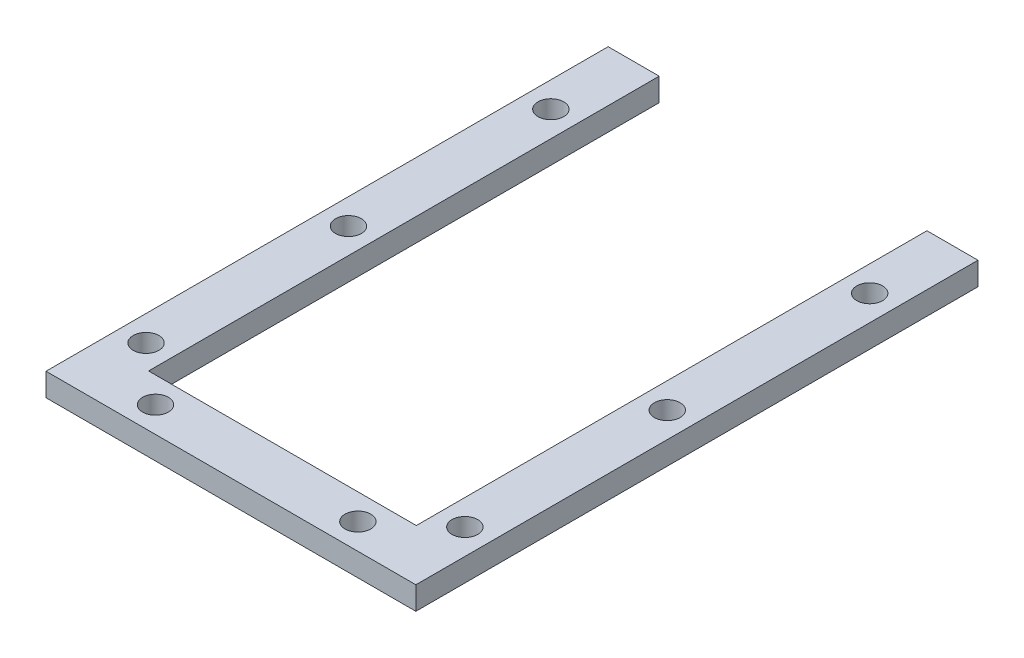
ISO-10303-21;
HEADER;
FILE_DESCRIPTION(('STEP AP214'),'2;1');
FILE_NAME('part.step','',(''),(''),'','','');
FILE_SCHEMA(('AUTOMOTIVE_DESIGN { 1 0 10303 214 1 1 1 1 }'));
ENDSEC;
DATA;
#1=APPLICATION_CONTEXT('core data for automotive mechanical design processes');
#2=APPLICATION_PROTOCOL_DEFINITION('international standard','automotive_design',2000,#1);
#3=PRODUCT_CONTEXT('',#1,'mechanical');
#4=PRODUCT('Part','Part','',(#3));
#5=PRODUCT_RELATED_PRODUCT_CATEGORY('part','',(#4));
#6=PRODUCT_DEFINITION_FORMATION('','',#4);
#7=PRODUCT_DEFINITION_CONTEXT('part definition',#1,'design');
#8=PRODUCT_DEFINITION('design','',#6,#7);
#9=PRODUCT_DEFINITION_SHAPE('','',#8);
#10=(LENGTH_UNIT() NAMED_UNIT(*) SI_UNIT(.MILLI.,.METRE.));
#11=(NAMED_UNIT(*) PLANE_ANGLE_UNIT() SI_UNIT($,.RADIAN.));
#12=(NAMED_UNIT(*) SI_UNIT($,.STERADIAN.) SOLID_ANGLE_UNIT());
#13=UNCERTAINTY_MEASURE_WITH_UNIT(LENGTH_MEASURE(1.E-05),#10,'distance_accuracy_value','');
#14=(GEOMETRIC_REPRESENTATION_CONTEXT(3) GLOBAL_UNCERTAINTY_ASSIGNED_CONTEXT((#13)) GLOBAL_UNIT_ASSIGNED_CONTEXT((#10,
#11,#12)) REPRESENTATION_CONTEXT('',''));
#15=CARTESIAN_POINT('',(0.,0.,0.));
#16=DIRECTION('',(0.,0.,1.));
#17=DIRECTION('',(1.,0.,0.));
#18=AXIS2_PLACEMENT_3D('',#15,#16,#17);
#19=CARTESIAN_POINT('',(0.,2.5,0.));
#20=DIRECTION('',(0.,1.,0.));
#21=DIRECTION('',(0.,0.,1.));
#22=AXIS2_PLACEMENT_3D('',#19,#20,#21);
#23=PLANE('',#22);
#24=CARTESIAN_POINT('',(17.3249999999997,2.5,-24.5));
#25=DIRECTION('',(0.,1.,0.));
#26=DIRECTION('',(0.,0.,-1.));
#27=AXIS2_PLACEMENT_3D('',#24,#25,#26);
#28=CIRCLE('',#27,1.39999999999999);
#29=CARTESIAN_POINT('',(17.3249999999997,2.5,-25.9));
#30=VERTEX_POINT('',#29);
#31=EDGE_CURVE('E211',#30,#30,#28,.T.);
#32=ORIENTED_EDGE('',*,*,#31,.F.);
#33=EDGE_LOOP('',(#32));
#34=FACE_BOUND('',#33,.T.);
#35=CARTESIAN_POINT('',(-17.3249999999996,2.5,-2.5));
#36=DIRECTION('',(0.,1.,0.));
#37=DIRECTION('',(0.,0.,1.));
#38=AXIS2_PLACEMENT_3D('',#35,#36,#37);
#39=CIRCLE('',#38,1.4);
#40=CARTESIAN_POINT('',(-17.3249999999996,2.5,-1.1));
#41=VERTEX_POINT('',#40);
#42=EDGE_CURVE('E199',#41,#41,#39,.T.);
#43=ORIENTED_EDGE('',*,*,#42,.F.);
#44=EDGE_LOOP('',(#43));
#45=FACE_BOUND('',#44,.T.);
#46=CARTESIAN_POINT('',(-17.325,2.5,-46.5));
#47=DIRECTION('',(0.,1.,0.));
#48=DIRECTION('',(0.,0.,1.));
#49=AXIS2_PLACEMENT_3D('',#46,#47,#48);
#50=CIRCLE('',#49,1.4);
#51=CARTESIAN_POINT('',(-17.325,2.5,-45.1));
#52=VERTEX_POINT('',#51);
#53=EDGE_CURVE('E187',#52,#52,#50,.T.);
#54=ORIENTED_EDGE('',*,*,#53,.F.);
#55=EDGE_LOOP('',(#54));
#56=FACE_BOUND('',#55,.T.);
#57=CARTESIAN_POINT('',(-11.,2.5,2.79999999999999));
#58=DIRECTION('',(0.,1.,0.));
#59=DIRECTION('',(0.,0.,1.));
#60=AXIS2_PLACEMENT_3D('',#57,#58,#59);
#61=CIRCLE('',#60,1.4);
#62=CARTESIAN_POINT('',(-11.,2.5,4.19999999999999));
#63=VERTEX_POINT('',#62);
#64=EDGE_CURVE('E133',#63,#63,#61,.T.);
#65=ORIENTED_EDGE('',*,*,#64,.F.);
#66=EDGE_LOOP('',(#65));
#67=FACE_BOUND('',#66,.T.);
#68=DIRECTION('',(-1.,0.,0.));
#69=VECTOR('',#68,1.);
#70=CARTESIAN_POINT('',(-14.55,2.5,-55.5));
#71=LINE('',#70,#69);
#72=CARTESIAN_POINT('',(-14.55,2.5,-55.5));
#73=VERTEX_POINT('',#72);
#74=CARTESIAN_POINT('',(-20.1,2.5,-55.5));
#75=VERTEX_POINT('',#74);
#76=EDGE_CURVE('E144',#73,#75,#71,.T.);
#77=ORIENTED_EDGE('',*,*,#76,.T.);
#78=DIRECTION('',(0.,0.,1.));
#79=VECTOR('',#78,1.);
#80=CARTESIAN_POINT('',(-20.1,2.5,-55.5));
#81=LINE('',#80,#79);
#82=CARTESIAN_POINT('',(-20.1,2.5,5.59999999999999));
#83=VERTEX_POINT('',#82);
#84=EDGE_CURVE('E92',#75,#83,#81,.T.);
#85=ORIENTED_EDGE('',*,*,#84,.T.);
#86=DIRECTION('',(1.,0.,0.));
#87=VECTOR('',#86,1.);
#88=CARTESIAN_POINT('',(-20.1,2.5,5.59999999999999));
#89=LINE('',#88,#87);
#90=CARTESIAN_POINT('',(20.1,2.5,5.59999999999998));
#91=VERTEX_POINT('',#90);
#92=EDGE_CURVE('E159',#83,#91,#89,.T.);
#93=ORIENTED_EDGE('',*,*,#92,.T.);
#94=DIRECTION('',(0.,0.,-1.));
#95=VECTOR('',#94,1.);
#96=CARTESIAN_POINT('',(20.1,2.5,5.59999999999998));
#97=LINE('',#96,#95);
#98=CARTESIAN_POINT('',(20.1,2.5,-55.5));
#99=VERTEX_POINT('',#98);
#100=EDGE_CURVE('E172',#91,#99,#97,.T.);
#101=ORIENTED_EDGE('',*,*,#100,.T.);
#102=DIRECTION('',(-1.,0.,0.));
#103=VECTOR('',#102,1.);
#104=CARTESIAN_POINT('',(20.1,2.5,-55.5));
#105=LINE('',#104,#103);
#106=CARTESIAN_POINT('',(14.55,2.5,-55.5));
#107=VERTEX_POINT('',#106);
#108=EDGE_CURVE('E111',#99,#107,#105,.T.);
#109=ORIENTED_EDGE('',*,*,#108,.T.);
#110=DIRECTION('',(0.,0.,1.));
#111=VECTOR('',#110,1.);
#112=CARTESIAN_POINT('',(14.55,2.5,-55.5));
#113=LINE('',#112,#111);
#114=CARTESIAN_POINT('',(14.55,2.5,0.));
#115=VERTEX_POINT('',#114);
#116=EDGE_CURVE('E105',#107,#115,#113,.T.);
#117=ORIENTED_EDGE('',*,*,#116,.T.);
#118=DIRECTION('',(-1.,0.,0.));
#119=VECTOR('',#118,1.);
#120=CARTESIAN_POINT('',(14.55,2.5,0.));
#121=LINE('',#120,#119);
#122=CARTESIAN_POINT('',(-14.55,2.5,0.));
#123=VERTEX_POINT('',#122);
#124=EDGE_CURVE('E109',#115,#123,#121,.T.);
#125=ORIENTED_EDGE('',*,*,#124,.T.);
#126=DIRECTION('',(0.,0.,-1.));
#127=VECTOR('',#126,1.);
#128=CARTESIAN_POINT('',(-14.55,2.5,0.));
#129=LINE('',#128,#127);
#130=EDGE_CURVE('E49',#123,#73,#129,.T.);
#131=ORIENTED_EDGE('',*,*,#130,.T.);
#132=EDGE_LOOP('',(#77,#85,#93,#101,#109,#117,#125,#131));
#133=FACE_BOUND('',#132,.T.);
#134=CARTESIAN_POINT('',(11.,2.5,2.79999999999999));
#135=DIRECTION('',(0.,1.,0.));
#136=DIRECTION('',(0.,0.,-1.));
#137=AXIS2_PLACEMENT_3D('',#134,#135,#136);
#138=CIRCLE('',#137,1.4);
#139=CARTESIAN_POINT('',(11.,2.5,1.39999999999999));
#140=VERTEX_POINT('',#139);
#141=EDGE_CURVE('E181',#140,#140,#138,.T.);
#142=ORIENTED_EDGE('',*,*,#141,.F.);
#143=EDGE_LOOP('',(#142));
#144=FACE_BOUND('',#143,.T.);
#145=CARTESIAN_POINT('',(-17.3249999999998,2.5,-24.5));
#146=DIRECTION('',(0.,1.,0.));
#147=DIRECTION('',(0.,0.,1.));
#148=AXIS2_PLACEMENT_3D('',#145,#146,#147);
#149=CIRCLE('',#148,1.4);
#150=CARTESIAN_POINT('',(-17.3249999999998,2.5,-23.1));
#151=VERTEX_POINT('',#150);
#152=EDGE_CURVE('E193',#151,#151,#149,.T.);
#153=ORIENTED_EDGE('',*,*,#152,.F.);
#154=EDGE_LOOP('',(#153));
#155=FACE_BOUND('',#154,.T.);
#156=CARTESIAN_POINT('',(17.3249999999999,2.5,-46.5));
#157=DIRECTION('',(0.,1.,0.));
#158=DIRECTION('',(0.,0.,-1.));
#159=AXIS2_PLACEMENT_3D('',#156,#157,#158);
#160=CIRCLE('',#159,1.39999999999999);
#161=CARTESIAN_POINT('',(17.3249999999999,2.5,-47.9));
#162=VERTEX_POINT('',#161);
#163=EDGE_CURVE('E205',#162,#162,#160,.T.);
#164=ORIENTED_EDGE('',*,*,#163,.F.);
#165=EDGE_LOOP('',(#164));
#166=FACE_BOUND('',#165,.T.);
#167=CARTESIAN_POINT('',(17.3249999999995,2.5,-2.50000000000005));
#168=DIRECTION('',(0.,1.,0.));
#169=DIRECTION('',(0.,0.,-1.));
#170=AXIS2_PLACEMENT_3D('',#167,#168,#169);
#171=CIRCLE('',#170,1.4);
#172=CARTESIAN_POINT('',(17.3249999999995,2.5,-3.90000000000005));
#173=VERTEX_POINT('',#172);
#174=EDGE_CURVE('E217',#173,#173,#171,.T.);
#175=ORIENTED_EDGE('',*,*,#174,.F.);
#176=EDGE_LOOP('',(#175));
#177=FACE_BOUND('',#176,.T.);
#178=ADVANCED_FACE('F32',(#34,#45,#56,#67,#133,#144,#155,#166,#177),#23,.T.);
#179=CARTESIAN_POINT('',(0.,0.,0.));
#180=DIRECTION('',(0.,1.,0.));
#181=DIRECTION('',(0.,0.,1.));
#182=AXIS2_PLACEMENT_3D('',#179,#180,#181);
#183=PLANE('',#182);
#184=DIRECTION('',(-1.,0.,0.));
#185=VECTOR('',#184,1.);
#186=CARTESIAN_POINT('',(-14.55,0.,-55.5));
#187=LINE('',#186,#185);
#188=CARTESIAN_POINT('',(-14.55,0.,-55.5));
#189=VERTEX_POINT('',#188);
#190=CARTESIAN_POINT('',(-20.1,0.,-55.5));
#191=VERTEX_POINT('',#190);
#192=EDGE_CURVE('E129',#189,#191,#187,.T.);
#193=ORIENTED_EDGE('',*,*,#192,.F.);
#194=DIRECTION('',(0.,0.,-1.));
#195=VECTOR('',#194,1.);
#196=CARTESIAN_POINT('',(-14.55,0.,0.));
#197=LINE('',#196,#195);
#198=CARTESIAN_POINT('',(-14.55,0.,0.));
#199=VERTEX_POINT('',#198);
#200=EDGE_CURVE('E84',#199,#189,#197,.T.);
#201=ORIENTED_EDGE('',*,*,#200,.F.);
#202=DIRECTION('',(-1.,0.,0.));
#203=VECTOR('',#202,1.);
#204=CARTESIAN_POINT('',(14.55,0.,0.));
#205=LINE('',#204,#203);
#206=CARTESIAN_POINT('',(14.55,0.,0.));
#207=VERTEX_POINT('',#206);
#208=EDGE_CURVE('E78',#207,#199,#205,.T.);
#209=ORIENTED_EDGE('',*,*,#208,.F.);
#210=DIRECTION('',(0.,0.,1.));
#211=VECTOR('',#210,1.);
#212=CARTESIAN_POINT('',(14.55,0.,-55.5));
#213=LINE('',#212,#211);
#214=CARTESIAN_POINT('',(14.55,0.,-55.5));
#215=VERTEX_POINT('',#214);
#216=EDGE_CURVE('E119',#215,#207,#213,.T.);
#217=ORIENTED_EDGE('',*,*,#216,.F.);
#218=DIRECTION('',(-1.,0.,0.));
#219=VECTOR('',#218,1.);
#220=CARTESIAN_POINT('',(20.1,0.,-55.5));
#221=LINE('',#220,#219);
#222=CARTESIAN_POINT('',(20.1,0.,-55.5));
#223=VERTEX_POINT('',#222);
#224=EDGE_CURVE('E139',#223,#215,#221,.T.);
#225=ORIENTED_EDGE('',*,*,#224,.F.);
#226=DIRECTION('',(0.,0.,-1.));
#227=VECTOR('',#226,1.);
#228=CARTESIAN_POINT('',(20.1,0.,5.59999999999998));
#229=LINE('',#228,#227);
#230=CARTESIAN_POINT('',(20.1,0.,5.59999999999998));
#231=VERTEX_POINT('',#230);
#232=EDGE_CURVE('E137',#231,#223,#229,.T.);
#233=ORIENTED_EDGE('',*,*,#232,.F.);
#234=DIRECTION('',(1.,0.,0.));
#235=VECTOR('',#234,1.);
#236=CARTESIAN_POINT('',(-20.1,0.,5.59999999999999));
#237=LINE('',#236,#235);
#238=CARTESIAN_POINT('',(-20.1,0.,5.59999999999999));
#239=VERTEX_POINT('',#238);
#240=EDGE_CURVE('E135',#239,#231,#237,.T.);
#241=ORIENTED_EDGE('',*,*,#240,.F.);
#242=DIRECTION('',(0.,0.,1.));
#243=VECTOR('',#242,1.);
#244=CARTESIAN_POINT('',(-20.1,0.,-55.5));
#245=LINE('',#244,#243);
#246=EDGE_CURVE('E132',#191,#239,#245,.T.);
#247=ORIENTED_EDGE('',*,*,#246,.F.);
#248=EDGE_LOOP('',(#193,#201,#209,#217,#225,#233,#241,#247));
#249=FACE_BOUND('',#248,.T.);
#250=CARTESIAN_POINT('',(-11.,0.,2.79999999999999));
#251=DIRECTION('',(0.,1.,0.));
#252=DIRECTION('',(0.,0.,1.));
#253=AXIS2_PLACEMENT_3D('',#250,#251,#252);
#254=CIRCLE('',#253,1.4);
#255=CARTESIAN_POINT('',(-11.,0.,4.19999999999999));
#256=VERTEX_POINT('',#255);
#257=EDGE_CURVE('E178',#256,#256,#254,.T.);
#258=ORIENTED_EDGE('',*,*,#257,.T.);
#259=EDGE_LOOP('',(#258));
#260=FACE_BOUND('',#259,.T.);
#261=CARTESIAN_POINT('',(11.,0.,2.79999999999999));
#262=DIRECTION('',(0.,1.,0.));
#263=DIRECTION('',(0.,0.,-1.));
#264=AXIS2_PLACEMENT_3D('',#261,#262,#263);
#265=CIRCLE('',#264,1.4);
#266=CARTESIAN_POINT('',(11.,0.,1.39999999999999));
#267=VERTEX_POINT('',#266);
#268=EDGE_CURVE('E184',#267,#267,#265,.T.);
#269=ORIENTED_EDGE('',*,*,#268,.T.);
#270=EDGE_LOOP('',(#269));
#271=FACE_BOUND('',#270,.T.);
#272=CARTESIAN_POINT('',(-17.325,0.,-46.5));
#273=DIRECTION('',(0.,1.,0.));
#274=DIRECTION('',(0.,0.,1.));
#275=AXIS2_PLACEMENT_3D('',#272,#273,#274);
#276=CIRCLE('',#275,1.4);
#277=CARTESIAN_POINT('',(-17.325,0.,-45.1));
#278=VERTEX_POINT('',#277);
#279=EDGE_CURVE('E190',#278,#278,#276,.T.);
#280=ORIENTED_EDGE('',*,*,#279,.T.);
#281=EDGE_LOOP('',(#280));
#282=FACE_BOUND('',#281,.T.);
#283=CARTESIAN_POINT('',(-17.3249999999998,0.,-24.5));
#284=DIRECTION('',(0.,1.,0.));
#285=DIRECTION('',(0.,0.,1.));
#286=AXIS2_PLACEMENT_3D('',#283,#284,#285);
#287=CIRCLE('',#286,1.4);
#288=CARTESIAN_POINT('',(-17.3249999999998,0.,-23.1));
#289=VERTEX_POINT('',#288);
#290=EDGE_CURVE('E196',#289,#289,#287,.T.);
#291=ORIENTED_EDGE('',*,*,#290,.T.);
#292=EDGE_LOOP('',(#291));
#293=FACE_BOUND('',#292,.T.);
#294=CARTESIAN_POINT('',(-17.3249999999996,0.,-2.5));
#295=DIRECTION('',(0.,1.,0.));
#296=DIRECTION('',(0.,0.,1.));
#297=AXIS2_PLACEMENT_3D('',#294,#295,#296);
#298=CIRCLE('',#297,1.4);
#299=CARTESIAN_POINT('',(-17.3249999999996,0.,-1.1));
#300=VERTEX_POINT('',#299);
#301=EDGE_CURVE('E202',#300,#300,#298,.T.);
#302=ORIENTED_EDGE('',*,*,#301,.T.);
#303=EDGE_LOOP('',(#302));
#304=FACE_BOUND('',#303,.T.);
#305=CARTESIAN_POINT('',(17.3249999999999,0.,-46.5));
#306=DIRECTION('',(0.,1.,0.));
#307=DIRECTION('',(0.,0.,-1.));
#308=AXIS2_PLACEMENT_3D('',#305,#306,#307);
#309=CIRCLE('',#308,1.39999999999999);
#310=CARTESIAN_POINT('',(17.3249999999999,0.,-47.9));
#311=VERTEX_POINT('',#310);
#312=EDGE_CURVE('E208',#311,#311,#309,.T.);
#313=ORIENTED_EDGE('',*,*,#312,.T.);
#314=EDGE_LOOP('',(#313));
#315=FACE_BOUND('',#314,.T.);
#316=CARTESIAN_POINT('',(17.3249999999997,0.,-24.5));
#317=DIRECTION('',(0.,1.,0.));
#318=DIRECTION('',(0.,0.,-1.));
#319=AXIS2_PLACEMENT_3D('',#316,#317,#318);
#320=CIRCLE('',#319,1.39999999999999);
#321=CARTESIAN_POINT('',(17.3249999999997,0.,-25.9));
#322=VERTEX_POINT('',#321);
#323=EDGE_CURVE('E214',#322,#322,#320,.T.);
#324=ORIENTED_EDGE('',*,*,#323,.T.);
#325=EDGE_LOOP('',(#324));
#326=FACE_BOUND('',#325,.T.);
#327=CARTESIAN_POINT('',(17.3249999999995,0.,-2.50000000000005));
#328=DIRECTION('',(0.,1.,0.));
#329=DIRECTION('',(0.,0.,-1.));
#330=AXIS2_PLACEMENT_3D('',#327,#328,#329);
#331=CIRCLE('',#330,1.4);
#332=CARTESIAN_POINT('',(17.3249999999995,0.,-3.90000000000005));
#333=VERTEX_POINT('',#332);
#334=EDGE_CURVE('E220',#333,#333,#331,.T.);
#335=ORIENTED_EDGE('',*,*,#334,.T.);
#336=EDGE_LOOP('',(#335));
#337=FACE_BOUND('',#336,.T.);
#338=ADVANCED_FACE('F163',(#249,#260,#271,#282,#293,#304,#315,#326,#337),#183,.F.);
#339=CARTESIAN_POINT('',(-14.55,2.5,-55.5));
#340=DIRECTION('',(0.,0.,1.));
#341=DIRECTION('',(1.,0.,0.));
#342=AXIS2_PLACEMENT_3D('',#339,#340,#341);
#343=PLANE('',#342);
#344=ORIENTED_EDGE('',*,*,#192,.T.);
#345=DIRECTION('',(0.,-1.,0.));
#346=VECTOR('',#345,1.);
#347=CARTESIAN_POINT('',(-20.1,2.5,-55.5));
#348=LINE('',#347,#346);
#349=EDGE_CURVE('E11',#75,#191,#348,.T.);
#350=ORIENTED_EDGE('',*,*,#349,.F.);
#351=ORIENTED_EDGE('',*,*,#76,.F.);
#352=DIRECTION('',(0.,-1.,0.));
#353=VECTOR('',#352,1.);
#354=CARTESIAN_POINT('',(-14.55,2.5,-55.5));
#355=LINE('',#354,#353);
#356=EDGE_CURVE('E125',#73,#189,#355,.T.);
#357=ORIENTED_EDGE('',*,*,#356,.T.);
#358=EDGE_LOOP('',(#344,#350,#351,#357));
#359=FACE_BOUND('',#358,.T.);
#360=ADVANCED_FACE('F34',(#359),#343,.F.);
#361=CARTESIAN_POINT('',(-20.1,2.5,-55.5));
#362=DIRECTION('',(1.,0.,0.));
#363=DIRECTION('',(0.,0.,-1.));
#364=AXIS2_PLACEMENT_3D('',#361,#362,#363);
#365=PLANE('',#364);
#366=ORIENTED_EDGE('',*,*,#246,.T.);
#367=DIRECTION('',(0.,-1.,0.));
#368=VECTOR('',#367,1.);
#369=CARTESIAN_POINT('',(-20.1,2.5,5.59999999999999));
#370=LINE('',#369,#368);
#371=EDGE_CURVE('E41',#83,#239,#370,.T.);
#372=ORIENTED_EDGE('',*,*,#371,.F.);
#373=ORIENTED_EDGE('',*,*,#84,.F.);
#374=ORIENTED_EDGE('',*,*,#349,.T.);
#375=EDGE_LOOP('',(#366,#372,#373,#374));
#376=FACE_BOUND('',#375,.T.);
#377=ADVANCED_FACE('F254',(#376),#365,.F.);
#378=CARTESIAN_POINT('',(-20.1,2.5,5.59999999999999));
#379=DIRECTION('',(0.,0.,-1.));
#380=DIRECTION('',(-1.,0.,0.));
#381=AXIS2_PLACEMENT_3D('',#378,#379,#380);
#382=PLANE('',#381);
#383=ORIENTED_EDGE('',*,*,#240,.T.);
#384=DIRECTION('',(0.,-1.,0.));
#385=VECTOR('',#384,1.);
#386=CARTESIAN_POINT('',(20.1,2.5,5.59999999999998));
#387=LINE('',#386,#385);
#388=EDGE_CURVE('E151',#91,#231,#387,.T.);
#389=ORIENTED_EDGE('',*,*,#388,.F.);
#390=ORIENTED_EDGE('',*,*,#92,.F.);
#391=ORIENTED_EDGE('',*,*,#371,.T.);
#392=EDGE_LOOP('',(#383,#389,#390,#391));
#393=FACE_BOUND('',#392,.T.);
#394=ADVANCED_FACE('F157',(#393),#382,.F.);
#395=CARTESIAN_POINT('',(20.1,2.5,5.59999999999998));
#396=DIRECTION('',(-1.,0.,0.));
#397=DIRECTION('',(0.,0.,1.));
#398=AXIS2_PLACEMENT_3D('',#395,#396,#397);
#399=PLANE('',#398);
#400=ORIENTED_EDGE('',*,*,#232,.T.);
#401=DIRECTION('',(0.,-1.,0.));
#402=VECTOR('',#401,1.);
#403=CARTESIAN_POINT('',(20.1,2.5,-55.5));
#404=LINE('',#403,#402);
#405=EDGE_CURVE('E148',#99,#223,#404,.T.);
#406=ORIENTED_EDGE('',*,*,#405,.F.);
#407=ORIENTED_EDGE('',*,*,#100,.F.);
#408=ORIENTED_EDGE('',*,*,#388,.T.);
#409=EDGE_LOOP('',(#400,#406,#407,#408));
#410=FACE_BOUND('',#409,.T.);
#411=ADVANCED_FACE('F168',(#410),#399,.F.);
#412=CARTESIAN_POINT('',(20.1,2.5,-55.5));
#413=DIRECTION('',(0.,0.,1.));
#414=DIRECTION('',(1.,0.,0.));
#415=AXIS2_PLACEMENT_3D('',#412,#413,#414);
#416=PLANE('',#415);
#417=ORIENTED_EDGE('',*,*,#224,.T.);
#418=DIRECTION('',(0.,-1.,0.));
#419=VECTOR('',#418,1.);
#420=CARTESIAN_POINT('',(14.55,2.5,-55.5));
#421=LINE('',#420,#419);
#422=EDGE_CURVE('E120',#107,#215,#421,.T.);
#423=ORIENTED_EDGE('',*,*,#422,.F.);
#424=ORIENTED_EDGE('',*,*,#108,.F.);
#425=ORIENTED_EDGE('',*,*,#405,.T.);
#426=EDGE_LOOP('',(#417,#423,#424,#425));
#427=FACE_BOUND('',#426,.T.);
#428=ADVANCED_FACE('F171',(#427),#416,.F.);
#429=CARTESIAN_POINT('',(14.55,2.5,-55.5));
#430=DIRECTION('',(1.,0.,0.));
#431=DIRECTION('',(0.,0.,-1.));
#432=AXIS2_PLACEMENT_3D('',#429,#430,#431);
#433=PLANE('',#432);
#434=ORIENTED_EDGE('',*,*,#216,.T.);
#435=DIRECTION('',(0.,-1.,0.));
#436=VECTOR('',#435,1.);
#437=CARTESIAN_POINT('',(14.55,2.5,0.));
#438=LINE('',#437,#436);
#439=EDGE_CURVE('E116',#115,#207,#438,.T.);
#440=ORIENTED_EDGE('',*,*,#439,.F.);
#441=ORIENTED_EDGE('',*,*,#116,.F.);
#442=ORIENTED_EDGE('',*,*,#422,.T.);
#443=EDGE_LOOP('',(#434,#440,#441,#442));
#444=FACE_BOUND('',#443,.T.);
#445=ADVANCED_FACE('F117',(#444),#433,.F.);
#446=CARTESIAN_POINT('',(14.55,2.5,0.));
#447=DIRECTION('',(0.,0.,1.));
#448=DIRECTION('',(1.,0.,0.));
#449=AXIS2_PLACEMENT_3D('',#446,#447,#448);
#450=PLANE('',#449);
#451=ORIENTED_EDGE('',*,*,#208,.T.);
#452=DIRECTION('',(0.,-1.,0.));
#453=VECTOR('',#452,1.);
#454=CARTESIAN_POINT('',(-14.55,2.5,0.));
#455=LINE('',#454,#453);
#456=EDGE_CURVE('E121',#123,#199,#455,.T.);
#457=ORIENTED_EDGE('',*,*,#456,.F.);
#458=ORIENTED_EDGE('',*,*,#124,.F.);
#459=ORIENTED_EDGE('',*,*,#439,.T.);
#460=EDGE_LOOP('',(#451,#457,#458,#459));
#461=FACE_BOUND('',#460,.T.);
#462=ADVANCED_FACE('F123',(#461),#450,.F.);
#463=CARTESIAN_POINT('',(-14.55,2.5,0.));
#464=DIRECTION('',(-1.,0.,0.));
#465=DIRECTION('',(0.,0.,1.));
#466=AXIS2_PLACEMENT_3D('',#463,#464,#465);
#467=PLANE('',#466);
#468=ORIENTED_EDGE('',*,*,#200,.T.);
#469=ORIENTED_EDGE('',*,*,#356,.F.);
#470=ORIENTED_EDGE('',*,*,#130,.F.);
#471=ORIENTED_EDGE('',*,*,#456,.T.);
#472=EDGE_LOOP('',(#468,#469,#470,#471));
#473=FACE_BOUND('',#472,.T.);
#474=ADVANCED_FACE('F242',(#473),#467,.F.);
#475=CARTESIAN_POINT('',(-11.,2.5,2.79999999999999));
#476=DIRECTION('',(0.,-1.,0.));
#477=DIRECTION('',(0.,0.,-1.));
#478=AXIS2_PLACEMENT_3D('',#475,#476,#477);
#479=CYLINDRICAL_SURFACE('',#478,1.4);
#480=ORIENTED_EDGE('',*,*,#64,.T.);
#481=EDGE_LOOP('',(#480));
#482=FACE_BOUND('',#481,.T.);
#483=ORIENTED_EDGE('',*,*,#257,.F.);
#484=EDGE_LOOP('',(#483));
#485=FACE_BOUND('',#484,.T.);
#486=ADVANCED_FACE('F239',(#482,#485),#479,.F.);
#487=CARTESIAN_POINT('',(11.,2.5,2.79999999999999));
#488=DIRECTION('',(0.,-1.,0.));
#489=DIRECTION('',(0.,0.,-1.));
#490=AXIS2_PLACEMENT_3D('',#487,#488,#489);
#491=CYLINDRICAL_SURFACE('',#490,1.4);
#492=ORIENTED_EDGE('',*,*,#141,.T.);
#493=EDGE_LOOP('',(#492));
#494=FACE_BOUND('',#493,.T.);
#495=ORIENTED_EDGE('',*,*,#268,.F.);
#496=EDGE_LOOP('',(#495));
#497=FACE_BOUND('',#496,.T.);
#498=ADVANCED_FACE('F318',(#494,#497),#491,.F.);
#499=CARTESIAN_POINT('',(-17.325,2.5,-46.5));
#500=DIRECTION('',(0.,-1.,0.));
#501=DIRECTION('',(0.,0.,-1.));
#502=AXIS2_PLACEMENT_3D('',#499,#500,#501);
#503=CYLINDRICAL_SURFACE('',#502,1.4);
#504=ORIENTED_EDGE('',*,*,#53,.T.);
#505=EDGE_LOOP('',(#504));
#506=FACE_BOUND('',#505,.T.);
#507=ORIENTED_EDGE('',*,*,#279,.F.);
#508=EDGE_LOOP('',(#507));
#509=FACE_BOUND('',#508,.T.);
#510=ADVANCED_FACE('F326',(#506,#509),#503,.F.);
#511=CARTESIAN_POINT('',(-17.3249999999998,2.5,-24.5));
#512=DIRECTION('',(0.,-1.,0.));
#513=DIRECTION('',(0.,0.,-1.));
#514=AXIS2_PLACEMENT_3D('',#511,#512,#513);
#515=CYLINDRICAL_SURFACE('',#514,1.4);
#516=ORIENTED_EDGE('',*,*,#152,.T.);
#517=EDGE_LOOP('',(#516));
#518=FACE_BOUND('',#517,.T.);
#519=ORIENTED_EDGE('',*,*,#290,.F.);
#520=EDGE_LOOP('',(#519));
#521=FACE_BOUND('',#520,.T.);
#522=ADVANCED_FACE('F334',(#518,#521),#515,.F.);
#523=CARTESIAN_POINT('',(-17.3249999999996,2.5,-2.5));
#524=DIRECTION('',(0.,-1.,0.));
#525=DIRECTION('',(0.,0.,-1.));
#526=AXIS2_PLACEMENT_3D('',#523,#524,#525);
#527=CYLINDRICAL_SURFACE('',#526,1.4);
#528=ORIENTED_EDGE('',*,*,#42,.T.);
#529=EDGE_LOOP('',(#528));
#530=FACE_BOUND('',#529,.T.);
#531=ORIENTED_EDGE('',*,*,#301,.F.);
#532=EDGE_LOOP('',(#531));
#533=FACE_BOUND('',#532,.T.);
#534=ADVANCED_FACE('F343',(#530,#533),#527,.F.);
#535=CARTESIAN_POINT('',(17.3249999999999,2.5,-46.5));
#536=DIRECTION('',(0.,-1.,0.));
#537=DIRECTION('',(0.,0.,-1.));
#538=AXIS2_PLACEMENT_3D('',#535,#536,#537);
#539=CYLINDRICAL_SURFACE('',#538,1.39999999999999);
#540=ORIENTED_EDGE('',*,*,#163,.T.);
#541=EDGE_LOOP('',(#540));
#542=FACE_BOUND('',#541,.T.);
#543=ORIENTED_EDGE('',*,*,#312,.F.);
#544=EDGE_LOOP('',(#543));
#545=FACE_BOUND('',#544,.T.);
#546=ADVANCED_FACE('F352',(#542,#545),#539,.F.);
#547=CARTESIAN_POINT('',(17.3249999999997,2.5,-24.5));
#548=DIRECTION('',(0.,-1.,0.));
#549=DIRECTION('',(0.,0.,-1.));
#550=AXIS2_PLACEMENT_3D('',#547,#548,#549);
#551=CYLINDRICAL_SURFACE('',#550,1.39999999999999);
#552=ORIENTED_EDGE('',*,*,#31,.T.);
#553=EDGE_LOOP('',(#552));
#554=FACE_BOUND('',#553,.T.);
#555=ORIENTED_EDGE('',*,*,#323,.F.);
#556=EDGE_LOOP('',(#555));
#557=FACE_BOUND('',#556,.T.);
#558=ADVANCED_FACE('F361',(#554,#557),#551,.F.);
#559=CARTESIAN_POINT('',(17.3249999999995,2.5,-2.50000000000005));
#560=DIRECTION('',(0.,-1.,0.));
#561=DIRECTION('',(0.,0.,-1.));
#562=AXIS2_PLACEMENT_3D('',#559,#560,#561);
#563=CYLINDRICAL_SURFACE('',#562,1.4);
#564=ORIENTED_EDGE('',*,*,#174,.T.);
#565=EDGE_LOOP('',(#564));
#566=FACE_BOUND('',#565,.T.);
#567=ORIENTED_EDGE('',*,*,#334,.F.);
#568=EDGE_LOOP('',(#567));
#569=FACE_BOUND('',#568,.T.);
#570=ADVANCED_FACE('F226',(#566,#569),#563,.F.);
#571=CLOSED_SHELL('',(#178,#338,#360,#377,#394,#411,#428,#445,#462,#474,#486,#498,#510,#522,
#534,#546,#558,#570));
#572=MANIFOLD_SOLID_BREP('B2',#571);
#573=ADVANCED_BREP_SHAPE_REPRESENTATION('',(#18,#572),#14);
#574=SHAPE_DEFINITION_REPRESENTATION(#9,#573);
ENDSEC;
END-ISO-10303-21;
